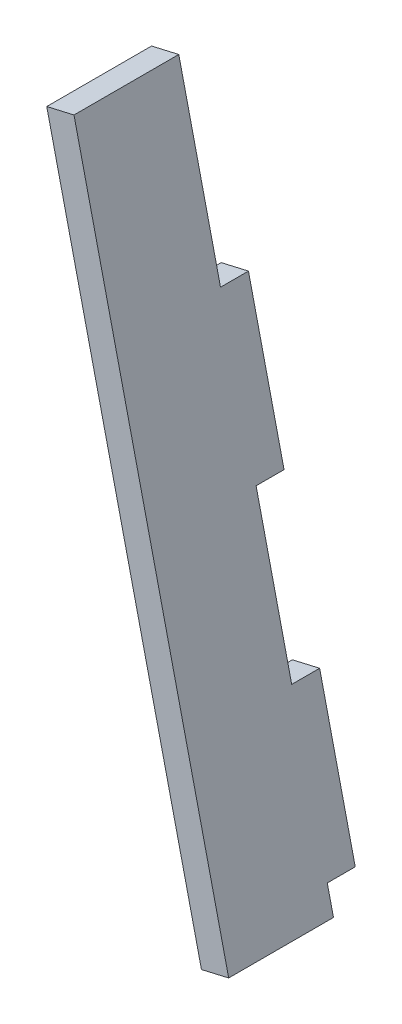
ISO-10303-21;
HEADER;
FILE_DESCRIPTION(('STEP AP214'),'2;1');
FILE_NAME('part.step','',(''),(''),'','','');
FILE_SCHEMA(('AUTOMOTIVE_DESIGN { 1 0 10303 214 1 1 1 1 }'));
ENDSEC;
DATA;
#1=APPLICATION_CONTEXT('core data for automotive mechanical design processes');
#2=APPLICATION_PROTOCOL_DEFINITION('international standard','automotive_design',2000,#1);
#3=PRODUCT_CONTEXT('',#1,'mechanical');
#4=PRODUCT('Part','Part','',(#3));
#5=PRODUCT_RELATED_PRODUCT_CATEGORY('part','',(#4));
#6=PRODUCT_DEFINITION_FORMATION('','',#4);
#7=PRODUCT_DEFINITION_CONTEXT('part definition',#1,'design');
#8=PRODUCT_DEFINITION('design','',#6,#7);
#9=PRODUCT_DEFINITION_SHAPE('','',#8);
#10=(LENGTH_UNIT() NAMED_UNIT(*) SI_UNIT(.MILLI.,.METRE.));
#11=(NAMED_UNIT(*) PLANE_ANGLE_UNIT() SI_UNIT($,.RADIAN.));
#12=(NAMED_UNIT(*) SI_UNIT($,.STERADIAN.) SOLID_ANGLE_UNIT());
#13=UNCERTAINTY_MEASURE_WITH_UNIT(LENGTH_MEASURE(1.E-05),#10,'distance_accuracy_value','');
#14=(GEOMETRIC_REPRESENTATION_CONTEXT(3) GLOBAL_UNCERTAINTY_ASSIGNED_CONTEXT((#13)) GLOBAL_UNIT_ASSIGNED_CONTEXT((#10,
#11,#12)) REPRESENTATION_CONTEXT('',''));
#15=CARTESIAN_POINT('',(0.,0.,0.));
#16=DIRECTION('',(0.,0.,1.));
#17=DIRECTION('',(1.,0.,0.));
#18=AXIS2_PLACEMENT_3D('',#15,#16,#17);
#19=CARTESIAN_POINT('',(0.,0.,10.16));
#20=DIRECTION('',(0.,0.,-1.));
#21=DIRECTION('',(1.,0.,0.));
#22=AXIS2_PLACEMENT_3D('',#19,#20,#21);
#23=PLANE('',#22);
#24=DIRECTION('',(-0.974370064785233,-0.224951054343873,0.));
#25=VECTOR('',#24,1.);
#26=CARTESIAN_POINT('',(-130.424254472527,1639.66047165468,10.16));
#27=LINE('',#26,#25);
#28=CARTESIAN_POINT('',(-120.524654614309,1641.94597436682,10.16));
#29=VERTEX_POINT('',#28);
#30=CARTESIAN_POINT('',(-130.424254472527,1639.66047165468,10.16));
#31=VERTEX_POINT('',#30);
#32=EDGE_CURVE('E177',#29,#31,#27,.T.);
#33=ORIENTED_EDGE('',*,*,#32,.T.);
#34=DIRECTION('',(-0.224951054343868,0.974370064785235,0.));
#35=VECTOR('',#34,1.);
#36=CARTESIAN_POINT('',(-145.590589270012,1705.3530849313,10.16));
#37=LINE('',#36,#35);
#38=CARTESIAN_POINT('',(-145.590589270012,1705.3530849313,10.16));
#39=VERTEX_POINT('',#38);
#40=EDGE_CURVE('E143',#31,#39,#37,.T.);
#41=ORIENTED_EDGE('',*,*,#40,.T.);
#42=DIRECTION('',(0.974370064785233,0.224951054343876,0.));
#43=VECTOR('',#42,1.);
#44=CARTESIAN_POINT('',(-135.690989411794,1707.63858764344,10.16));
#45=LINE('',#44,#43);
#46=CARTESIAN_POINT('',(-135.690989411794,1707.63858764344,10.16));
#47=VERTEX_POINT('',#46);
#48=EDGE_CURVE('E130',#39,#47,#45,.T.);
#49=ORIENTED_EDGE('',*,*,#48,.T.);
#50=DIRECTION('',(0.224951054343868,-0.974370064785235,0.));
#51=VECTOR('',#50,1.);
#52=CARTESIAN_POINT('',(-135.690989411794,1707.63858764344,10.16));
#53=LINE('',#52,#51);
#54=EDGE_CURVE('E132',#47,#29,#53,.T.);
#55=ORIENTED_EDGE('',*,*,#54,.T.);
#56=EDGE_LOOP('',(#33,#41,#49,#55));
#57=FACE_BOUND('',#56,.T.);
#58=ADVANCED_FACE('F39',(#57),#23,.T.);
#59=CARTESIAN_POINT('',(-91.6023362274834,1471.50426938285,10.16));
#60=DIRECTION('',(-0.974370064785235,-0.224951054343868,0.));
#61=DIRECTION('',(0.224951054343868,-0.974370064785235,0.));
#62=AXIS2_PLACEMENT_3D('',#59,#60,#61);
#63=PLANE('',#62);
#64=DIRECTION('',(0.224951054343868,-0.974370064785234,0.));
#65=VECTOR('',#64,1.);
#66=CARTESIAN_POINT('',(-91.6023362274834,1471.50426938285,0.));
#67=LINE('',#66,#65);
#68=CARTESIAN_POINT('',(-104.542975642498,1527.5563368068,0.));
#69=VERTEX_POINT('',#68);
#70=CARTESIAN_POINT('',(-91.6023362274834,1471.50426938285,0.));
#71=VERTEX_POINT('',#70);
#72=EDGE_CURVE('E105',#69,#71,#67,.T.);
#73=ORIENTED_EDGE('',*,*,#72,.T.);
#74=DIRECTION('',(0.,0.,-1.));
#75=VECTOR('',#74,1.);
#76=CARTESIAN_POINT('',(-91.6023362274834,1471.50426938285,10.16));
#77=LINE('',#76,#75);
#78=CARTESIAN_POINT('',(-91.6023362274841,1471.50426938285,10.16));
#79=VERTEX_POINT('',#78);
#80=EDGE_CURVE('E43',#79,#71,#77,.T.);
#81=ORIENTED_EDGE('',*,*,#80,.F.);
#82=CARTESIAN_POINT('',(-89.3528256840451,1461.760568735,10.16));
#83=VERTEX_POINT('',#82);
#84=EDGE_CURVE('E150',#83,#79,#37,.T.);
#85=ORIENTED_EDGE('',*,*,#84,.F.);
#86=DIRECTION('',(0.,0.,-1.));
#87=VECTOR('',#86,1.);
#88=CARTESIAN_POINT('',(-89.3528256840451,1461.760568735,48.26));
#89=LINE('',#88,#87);
#90=CARTESIAN_POINT('',(-89.3528256840451,1461.760568735,48.26));
#91=VERTEX_POINT('',#90);
#92=EDGE_CURVE('E156',#91,#83,#89,.T.);
#93=ORIENTED_EDGE('',*,*,#92,.F.);
#94=DIRECTION('',(-0.224951054343868,0.974370064785235,0.));
#95=VECTOR('',#94,1.);
#96=CARTESIAN_POINT('',(-145.590589270012,1705.3530849313,48.26));
#97=LINE('',#96,#95);
#98=CARTESIAN_POINT('',(-145.590589270012,1705.3530849313,48.26));
#99=VERTEX_POINT('',#98);
#100=EDGE_CURVE('E157',#91,#99,#97,.T.);
#101=ORIENTED_EDGE('',*,*,#100,.T.);
#102=DIRECTION('',(0.,0.,-1.));
#103=VECTOR('',#102,1.);
#104=CARTESIAN_POINT('',(-145.590589270012,1705.3530849313,48.26));
#105=LINE('',#104,#103);
#106=EDGE_CURVE('E153',#99,#39,#105,.T.);
#107=ORIENTED_EDGE('',*,*,#106,.T.);
#108=ORIENTED_EDGE('',*,*,#40,.F.);
#109=DIRECTION('',(0.,0.,-1.));
#110=VECTOR('',#109,1.);
#111=CARTESIAN_POINT('',(-130.424254472527,1639.66047165468,10.16));
#112=LINE('',#111,#110);
#113=CARTESIAN_POINT('',(-130.424254472527,1639.66047165468,0.));
#114=VERTEX_POINT('',#113);
#115=EDGE_CURVE('E56',#31,#114,#112,.T.);
#116=ORIENTED_EDGE('',*,*,#115,.T.);
#117=DIRECTION('',(0.224951054343871,-0.974370064785234,0.));
#118=VECTOR('',#117,1.);
#119=CARTESIAN_POINT('',(-130.424254472527,1639.66047165468,0.));
#120=LINE('',#119,#118);
#121=CARTESIAN_POINT('',(-117.483615057512,1583.60840423074,0.));
#122=VERTEX_POINT('',#121);
#123=EDGE_CURVE('E226',#114,#122,#120,.T.);
#124=ORIENTED_EDGE('',*,*,#123,.T.);
#125=DIRECTION('',(0.,0.,-1.));
#126=VECTOR('',#125,1.);
#127=CARTESIAN_POINT('',(-117.483615057512,1583.60840423074,10.16));
#128=LINE('',#127,#126);
#129=CARTESIAN_POINT('',(-117.483615057512,1583.60840423074,10.16));
#130=VERTEX_POINT('',#129);
#131=EDGE_CURVE('E234',#130,#122,#128,.T.);
#132=ORIENTED_EDGE('',*,*,#131,.F.);
#133=CARTESIAN_POINT('',(-104.542975642499,1527.5563368068,10.16));
#134=VERTEX_POINT('',#133);
#135=EDGE_CURVE('E148',#134,#130,#37,.T.);
#136=ORIENTED_EDGE('',*,*,#135,.F.);
#137=DIRECTION('',(0.,0.,-1.));
#138=VECTOR('',#137,1.);
#139=CARTESIAN_POINT('',(-104.542975642498,1527.5563368068,10.16));
#140=LINE('',#139,#138);
#141=EDGE_CURVE('E11',#134,#69,#140,.T.);
#142=ORIENTED_EDGE('',*,*,#141,.T.);
#143=EDGE_LOOP('',(#73,#81,#85,#93,#101,#107,#108,#116,#124,#132,#136,#142));
#144=FACE_BOUND('',#143,.T.);
#145=ADVANCED_FACE('F41',(#144),#63,.T.);
#146=CARTESIAN_POINT('',(-104.542975642498,1527.5563368068,10.16));
#147=DIRECTION('',(-0.224951054343791,0.974370064785252,0.));
#148=DIRECTION('',(-0.974370064785252,-0.224951054343791,0.));
#149=AXIS2_PLACEMENT_3D('',#146,#147,#148);
#150=PLANE('',#149);
#151=DIRECTION('',(-0.974370064785252,-0.224951054343791,0.));
#152=VECTOR('',#151,1.);
#153=CARTESIAN_POINT('',(-104.542975642498,1527.5563368068,0.));
#154=LINE('',#153,#152);
#155=CARTESIAN_POINT('',(-94.6433757842798,1529.84183951893,0.));
#156=VERTEX_POINT('',#155);
#157=EDGE_CURVE('E93',#156,#69,#154,.T.);
#158=ORIENTED_EDGE('',*,*,#157,.T.);
#159=ORIENTED_EDGE('',*,*,#141,.F.);
#160=DIRECTION('',(-0.974370064785252,-0.224951054343791,0.));
#161=VECTOR('',#160,1.);
#162=CARTESIAN_POINT('',(-104.542975642498,1527.5563368068,10.16));
#163=LINE('',#162,#161);
#164=CARTESIAN_POINT('',(-94.6433757842804,1529.84183951893,10.16));
#165=VERTEX_POINT('',#164);
#166=EDGE_CURVE('E100',#165,#134,#163,.T.);
#167=ORIENTED_EDGE('',*,*,#166,.F.);
#168=DIRECTION('',(0.,0.,-1.));
#169=VECTOR('',#168,1.);
#170=CARTESIAN_POINT('',(-94.6433757842798,1529.84183951893,10.16));
#171=LINE('',#170,#169);
#172=EDGE_CURVE('E48',#165,#156,#171,.T.);
#173=ORIENTED_EDGE('',*,*,#172,.T.);
#174=EDGE_LOOP('',(#158,#159,#167,#173));
#175=FACE_BOUND('',#174,.T.);
#176=ADVANCED_FACE('F97',(#175),#150,.T.);
#177=CARTESIAN_POINT('',(-81.7027363692654,1473.78977209498,10.16));
#178=DIRECTION('',(0.974370064785234,0.224951054343871,0.));
#179=DIRECTION('',(-0.224951054343871,0.974370064785234,0.));
#180=AXIS2_PLACEMENT_3D('',#177,#178,#179);
#181=PLANE('',#180);
#182=DIRECTION('',(-0.224951054343871,0.974370064785234,0.));
#183=VECTOR('',#182,1.);
#184=CARTESIAN_POINT('',(-81.7027363692654,1473.78977209498,0.));
#185=LINE('',#184,#183);
#186=CARTESIAN_POINT('',(-81.7027363692654,1473.78977209498,0.));
#187=VERTEX_POINT('',#186);
#188=EDGE_CURVE('E84',#187,#156,#185,.T.);
#189=ORIENTED_EDGE('',*,*,#188,.T.);
#190=ORIENTED_EDGE('',*,*,#172,.F.);
#191=CARTESIAN_POINT('',(-107.584015199294,1585.89390694287,10.16));
#192=VERTEX_POINT('',#191);
#193=EDGE_CURVE('E129',#192,#165,#53,.T.);
#194=ORIENTED_EDGE('',*,*,#193,.F.);
#195=DIRECTION('',(0.,0.,-1.));
#196=VECTOR('',#195,1.);
#197=CARTESIAN_POINT('',(-107.584015199294,1585.89390694287,10.16));
#198=LINE('',#197,#196);
#199=CARTESIAN_POINT('',(-107.584015199294,1585.89390694287,0.));
#200=VERTEX_POINT('',#199);
#201=EDGE_CURVE('E203',#192,#200,#198,.T.);
#202=ORIENTED_EDGE('',*,*,#201,.T.);
#203=DIRECTION('',(-0.22495105434387,0.974370064785234,0.));
#204=VECTOR('',#203,1.);
#205=CARTESIAN_POINT('',(-120.524654614309,1641.94597436682,0.));
#206=LINE('',#205,#204);
#207=CARTESIAN_POINT('',(-120.524654614309,1641.94597436682,0.));
#208=VERTEX_POINT('',#207);
#209=EDGE_CURVE('E223',#200,#208,#206,.T.);
#210=ORIENTED_EDGE('',*,*,#209,.T.);
#211=DIRECTION('',(0.,0.,-1.));
#212=VECTOR('',#211,1.);
#213=CARTESIAN_POINT('',(-120.524654614309,1641.94597436682,10.16));
#214=LINE('',#213,#212);
#215=EDGE_CURVE('E176',#29,#208,#214,.T.);
#216=ORIENTED_EDGE('',*,*,#215,.F.);
#217=ORIENTED_EDGE('',*,*,#54,.F.);
#218=DIRECTION('',(0.,0.,-1.));
#219=VECTOR('',#218,1.);
#220=CARTESIAN_POINT('',(-135.690989411794,1707.63858764344,48.26));
#221=LINE('',#220,#219);
#222=CARTESIAN_POINT('',(-135.690989411794,1707.63858764344,48.26));
#223=VERTEX_POINT('',#222);
#224=EDGE_CURVE('E119',#223,#47,#221,.T.);
#225=ORIENTED_EDGE('',*,*,#224,.F.);
#226=DIRECTION('',(0.224951054343868,-0.974370064785235,0.));
#227=VECTOR('',#226,1.);
#228=CARTESIAN_POINT('',(-135.690989411794,1707.63858764344,48.26));
#229=LINE('',#228,#227);
#230=CARTESIAN_POINT('',(-79.4532258258271,1464.04607144713,48.26));
#231=VERTEX_POINT('',#230);
#232=EDGE_CURVE('E214',#223,#231,#229,.T.);
#233=ORIENTED_EDGE('',*,*,#232,.T.);
#234=DIRECTION('',(0.,0.,-1.));
#235=VECTOR('',#234,1.);
#236=CARTESIAN_POINT('',(-79.4532258258271,1464.04607144713,48.26));
#237=LINE('',#236,#235);
#238=CARTESIAN_POINT('',(-79.4532258258271,1464.04607144713,10.16));
#239=VERTEX_POINT('',#238);
#240=EDGE_CURVE('E127',#231,#239,#237,.T.);
#241=ORIENTED_EDGE('',*,*,#240,.T.);
#242=CARTESIAN_POINT('',(-81.7027363692654,1473.78977209498,10.16));
#243=VERTEX_POINT('',#242);
#244=EDGE_CURVE('E123',#243,#239,#53,.T.);
#245=ORIENTED_EDGE('',*,*,#244,.F.);
#246=DIRECTION('',(0.,0.,-1.));
#247=VECTOR('',#246,1.);
#248=CARTESIAN_POINT('',(-81.7027363692654,1473.78977209498,10.16));
#249=LINE('',#248,#247);
#250=EDGE_CURVE('E90',#243,#187,#249,.T.);
#251=ORIENTED_EDGE('',*,*,#250,.T.);
#252=EDGE_LOOP('',(#189,#190,#194,#202,#210,#216,#217,#225,#233,#241,#245,#251));
#253=FACE_BOUND('',#252,.T.);
#254=ADVANCED_FACE('F86',(#253),#181,.T.);
#255=CARTESIAN_POINT('',(-91.6023362274834,1471.50426938285,10.16));
#256=DIRECTION('',(0.224951054343896,-0.974370064785228,0.));
#257=DIRECTION('',(0.974370064785228,0.224951054343896,0.));
#258=AXIS2_PLACEMENT_3D('',#255,#256,#257);
#259=PLANE('',#258);
#260=DIRECTION('',(0.974370064785228,0.224951054343896,0.));
#261=VECTOR('',#260,1.);
#262=CARTESIAN_POINT('',(-91.6023362274834,1471.50426938285,0.));
#263=LINE('',#262,#261);
#264=EDGE_CURVE('E94',#71,#187,#263,.T.);
#265=ORIENTED_EDGE('',*,*,#264,.T.);
#266=ORIENTED_EDGE('',*,*,#250,.F.);
#267=DIRECTION('',(0.974370064785228,0.224951054343896,0.));
#268=VECTOR('',#267,1.);
#269=CARTESIAN_POINT('',(-91.6023362274834,1471.50426938285,10.16));
#270=LINE('',#269,#268);
#271=EDGE_CURVE('E65',#79,#243,#270,.T.);
#272=ORIENTED_EDGE('',*,*,#271,.F.);
#273=ORIENTED_EDGE('',*,*,#80,.T.);
#274=EDGE_LOOP('',(#265,#266,#272,#273));
#275=FACE_BOUND('',#274,.T.);
#276=ADVANCED_FACE('F120',(#275),#259,.T.);
#277=CARTESIAN_POINT('',(0.,0.,0.));
#278=DIRECTION('',(0.,0.,1.));
#279=DIRECTION('',(-1.,0.,0.));
#280=AXIS2_PLACEMENT_3D('',#277,#278,#279);
#281=PLANE('',#280);
#282=ORIENTED_EDGE('',*,*,#72,.F.);
#283=ORIENTED_EDGE('',*,*,#157,.F.);
#284=ORIENTED_EDGE('',*,*,#188,.F.);
#285=ORIENTED_EDGE('',*,*,#264,.F.);
#286=EDGE_LOOP('',(#282,#283,#284,#285));
#287=FACE_BOUND('',#286,.T.);
#288=ADVANCED_FACE('F103',(#287),#281,.F.);
#289=DIRECTION('',(0.974370064785233,0.224951054343874,0.));
#290=VECTOR('',#289,1.);
#291=CARTESIAN_POINT('',(-117.483615057512,1583.60840423074,10.16));
#292=LINE('',#291,#290);
#293=EDGE_CURVE('E199',#130,#192,#292,.T.);
#294=ORIENTED_EDGE('',*,*,#293,.T.);
#295=ORIENTED_EDGE('',*,*,#193,.T.);
#296=ORIENTED_EDGE('',*,*,#166,.T.);
#297=ORIENTED_EDGE('',*,*,#135,.T.);
#298=EDGE_LOOP('',(#294,#295,#296,#297));
#299=FACE_BOUND('',#298,.T.);
#300=ADVANCED_FACE('F196',(#299),#23,.T.);
#301=ORIENTED_EDGE('',*,*,#271,.T.);
#302=ORIENTED_EDGE('',*,*,#244,.T.);
#303=DIRECTION('',(-0.974370064785232,-0.224951054343878,0.));
#304=VECTOR('',#303,1.);
#305=CARTESIAN_POINT('',(-79.4532258258271,1464.04607144713,10.16));
#306=LINE('',#305,#304);
#307=EDGE_CURVE('E138',#239,#83,#306,.T.);
#308=ORIENTED_EDGE('',*,*,#307,.T.);
#309=ORIENTED_EDGE('',*,*,#84,.T.);
#310=EDGE_LOOP('',(#301,#302,#308,#309));
#311=FACE_BOUND('',#310,.T.);
#312=ADVANCED_FACE('F262',(#311),#23,.T.);
#313=CARTESIAN_POINT('',(-135.690989411794,1707.63858764344,48.26));
#314=DIRECTION('',(0.224951054343876,-0.974370064785233,0.));
#315=DIRECTION('',(0.974370064785233,0.224951054343876,0.));
#316=AXIS2_PLACEMENT_3D('',#313,#314,#315);
#317=PLANE('',#316);
#318=ORIENTED_EDGE('',*,*,#48,.F.);
#319=ORIENTED_EDGE('',*,*,#106,.F.);
#320=DIRECTION('',(0.974370064785233,0.224951054343876,0.));
#321=VECTOR('',#320,1.);
#322=CARTESIAN_POINT('',(-135.690989411794,1707.63858764344,48.26));
#323=LINE('',#322,#321);
#324=EDGE_CURVE('E152',#99,#223,#323,.T.);
#325=ORIENTED_EDGE('',*,*,#324,.T.);
#326=ORIENTED_EDGE('',*,*,#224,.T.);
#327=EDGE_LOOP('',(#318,#319,#325,#326));
#328=FACE_BOUND('',#327,.T.);
#329=ADVANCED_FACE('F165',(#328),#317,.F.);
#330=CARTESIAN_POINT('',(-79.4532258258271,1464.04607144713,48.26));
#331=DIRECTION('',(-0.224951054343878,0.974370064785232,0.));
#332=DIRECTION('',(-0.974370064785232,-0.224951054343878,0.));
#333=AXIS2_PLACEMENT_3D('',#330,#331,#332);
#334=PLANE('',#333);
#335=ORIENTED_EDGE('',*,*,#307,.F.);
#336=ORIENTED_EDGE('',*,*,#240,.F.);
#337=DIRECTION('',(-0.974370064785232,-0.224951054343878,0.));
#338=VECTOR('',#337,1.);
#339=CARTESIAN_POINT('',(-79.4532258258271,1464.04607144713,48.26));
#340=LINE('',#339,#338);
#341=EDGE_CURVE('E212',#231,#91,#340,.T.);
#342=ORIENTED_EDGE('',*,*,#341,.T.);
#343=ORIENTED_EDGE('',*,*,#92,.T.);
#344=EDGE_LOOP('',(#335,#336,#342,#343));
#345=FACE_BOUND('',#344,.T.);
#346=ADVANCED_FACE('F217',(#345),#334,.F.);
#347=CARTESIAN_POINT('',(0.,0.,48.26));
#348=DIRECTION('',(0.,0.,-1.));
#349=DIRECTION('',(1.,0.,0.));
#350=AXIS2_PLACEMENT_3D('',#347,#348,#349);
#351=PLANE('',#350);
#352=ORIENTED_EDGE('',*,*,#324,.F.);
#353=ORIENTED_EDGE('',*,*,#100,.F.);
#354=ORIENTED_EDGE('',*,*,#341,.F.);
#355=ORIENTED_EDGE('',*,*,#232,.F.);
#356=EDGE_LOOP('',(#352,#353,#354,#355));
#357=FACE_BOUND('',#356,.T.);
#358=ADVANCED_FACE('F213',(#357),#351,.F.);
#359=CARTESIAN_POINT('',(-130.424254472527,1639.66047165468,10.16));
#360=DIRECTION('',(-0.224951054343873,0.974370064785233,0.));
#361=DIRECTION('',(-0.974370064785233,-0.224951054343873,0.));
#362=AXIS2_PLACEMENT_3D('',#359,#360,#361);
#363=PLANE('',#362);
#364=DIRECTION('',(-0.974370064785233,-0.224951054343873,0.));
#365=VECTOR('',#364,1.);
#366=CARTESIAN_POINT('',(-130.424254472527,1639.66047165468,0.));
#367=LINE('',#366,#365);
#368=EDGE_CURVE('E134',#208,#114,#367,.T.);
#369=ORIENTED_EDGE('',*,*,#368,.T.);
#370=ORIENTED_EDGE('',*,*,#115,.F.);
#371=ORIENTED_EDGE('',*,*,#32,.F.);
#372=ORIENTED_EDGE('',*,*,#215,.T.);
#373=EDGE_LOOP('',(#369,#370,#371,#372));
#374=FACE_BOUND('',#373,.T.);
#375=ADVANCED_FACE('F251',(#374),#363,.T.);
#376=CARTESIAN_POINT('',(-117.483615057512,1583.60840423074,10.16));
#377=DIRECTION('',(0.224951054343874,-0.974370064785233,0.));
#378=DIRECTION('',(0.974370064785233,0.224951054343874,0.));
#379=AXIS2_PLACEMENT_3D('',#376,#377,#378);
#380=PLANE('',#379);
#381=DIRECTION('',(0.974370064785233,0.224951054343874,0.));
#382=VECTOR('',#381,1.);
#383=CARTESIAN_POINT('',(-117.483615057512,1583.60840423074,0.));
#384=LINE('',#383,#382);
#385=EDGE_CURVE('E228',#122,#200,#384,.T.);
#386=ORIENTED_EDGE('',*,*,#385,.T.);
#387=ORIENTED_EDGE('',*,*,#201,.F.);
#388=ORIENTED_EDGE('',*,*,#293,.F.);
#389=ORIENTED_EDGE('',*,*,#131,.T.);
#390=EDGE_LOOP('',(#386,#387,#388,#389));
#391=FACE_BOUND('',#390,.T.);
#392=ADVANCED_FACE('F240',(#391),#380,.T.);
#393=CARTESIAN_POINT('',(0.,0.,0.));
#394=DIRECTION('',(0.,0.,1.));
#395=DIRECTION('',(-1.,0.,0.));
#396=AXIS2_PLACEMENT_3D('',#393,#394,#395);
#397=PLANE('',#396);
#398=ORIENTED_EDGE('',*,*,#368,.F.);
#399=ORIENTED_EDGE('',*,*,#209,.F.);
#400=ORIENTED_EDGE('',*,*,#385,.F.);
#401=ORIENTED_EDGE('',*,*,#123,.F.);
#402=EDGE_LOOP('',(#398,#399,#400,#401));
#403=FACE_BOUND('',#402,.T.);
#404=ADVANCED_FACE('F248',(#403),#397,.F.);
#405=CLOSED_SHELL('',(#58,#145,#176,#254,#276,#288,#300,#312,#329,#346,#358,#375,#392,#404));
#406=MANIFOLD_SOLID_BREP('B2',#405);
#407=ADVANCED_BREP_SHAPE_REPRESENTATION('',(#18,#406),#14);
#408=SHAPE_DEFINITION_REPRESENTATION(#9,#407);
ENDSEC;
END-ISO-10303-21;
